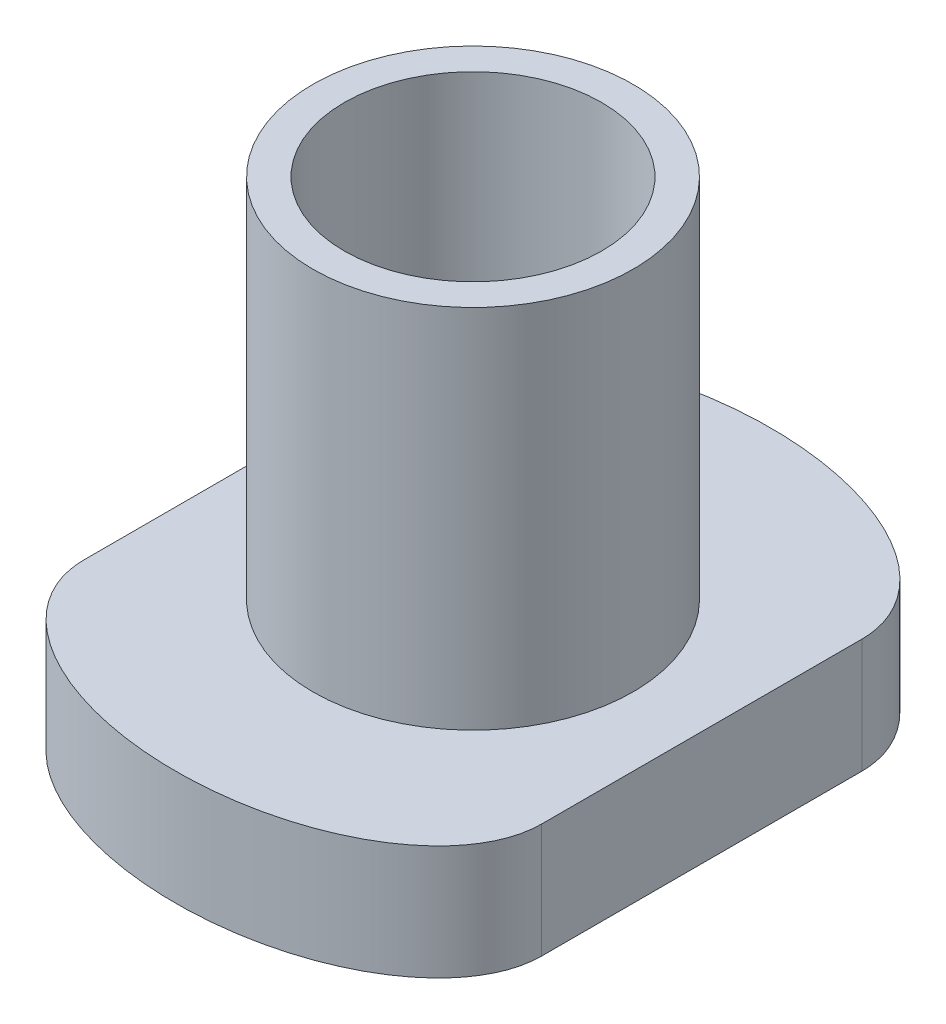
ISO-10303-21;
HEADER;
FILE_DESCRIPTION(('STEP AP214'),'2;1');
FILE_NAME('part.step','',(''),(''),'','','');
FILE_SCHEMA(('AUTOMOTIVE_DESIGN { 1 0 10303 214 1 1 1 1 }'));
ENDSEC;
DATA;
#1=APPLICATION_CONTEXT('core data for automotive mechanical design processes');
#2=APPLICATION_PROTOCOL_DEFINITION('international standard','automotive_design',2000,#1);
#3=PRODUCT_CONTEXT('',#1,'mechanical');
#4=PRODUCT('Part','Part','',(#3));
#5=PRODUCT_RELATED_PRODUCT_CATEGORY('part','',(#4));
#6=PRODUCT_DEFINITION_FORMATION('','',#4);
#7=PRODUCT_DEFINITION_CONTEXT('part definition',#1,'design');
#8=PRODUCT_DEFINITION('design','',#6,#7);
#9=PRODUCT_DEFINITION_SHAPE('','',#8);
#10=(LENGTH_UNIT() NAMED_UNIT(*) SI_UNIT(.MILLI.,.METRE.));
#11=(NAMED_UNIT(*) PLANE_ANGLE_UNIT() SI_UNIT($,.RADIAN.));
#12=(NAMED_UNIT(*) SI_UNIT($,.STERADIAN.) SOLID_ANGLE_UNIT());
#13=UNCERTAINTY_MEASURE_WITH_UNIT(LENGTH_MEASURE(1.E-05),#10,'distance_accuracy_value','');
#14=(GEOMETRIC_REPRESENTATION_CONTEXT(3) GLOBAL_UNCERTAINTY_ASSIGNED_CONTEXT((#13)) GLOBAL_UNIT_ASSIGNED_CONTEXT((#10,
#11,#12)) REPRESENTATION_CONTEXT('',''));
#15=CARTESIAN_POINT('',(0.,0.,0.));
#16=DIRECTION('',(0.,0.,1.));
#17=DIRECTION('',(1.,0.,0.));
#18=AXIS2_PLACEMENT_3D('',#15,#16,#17);
#19=CARTESIAN_POINT('',(0.,10.,-40.));
#20=DIRECTION('',(1.,0.,0.));
#21=DIRECTION('',(0.,0.,-1.));
#22=AXIS2_PLACEMENT_3D('',#19,#20,#21);
#23=PLANE('',#22);
#24=DIRECTION('',(0.,0.,1.));
#25=VECTOR('',#24,1.);
#26=CARTESIAN_POINT('',(0.,0.,-40.));
#27=LINE('',#26,#25);
#28=CARTESIAN_POINT('',(0.,0.,-40.));
#29=VERTEX_POINT('',#28);
#30=CARTESIAN_POINT('',(0.,0.,-12.));
#31=VERTEX_POINT('',#30);
#32=EDGE_CURVE('E118',#29,#31,#27,.T.);
#33=ORIENTED_EDGE('',*,*,#32,.T.);
#34=DIRECTION('',(0.,-1.,0.));
#35=VECTOR('',#34,1.);
#36=CARTESIAN_POINT('',(0.,10.,-12.));
#37=LINE('',#36,#35);
#38=CARTESIAN_POINT('',(0.,10.,-12.));
#39=VERTEX_POINT('',#38);
#40=EDGE_CURVE('E48',#39,#31,#37,.T.);
#41=ORIENTED_EDGE('',*,*,#40,.F.);
#42=DIRECTION('',(0.,0.,1.));
#43=VECTOR('',#42,1.);
#44=CARTESIAN_POINT('',(0.,10.,-40.));
#45=LINE('',#44,#43);
#46=CARTESIAN_POINT('',(0.,10.,-40.));
#47=VERTEX_POINT('',#46);
#48=EDGE_CURVE('E88',#47,#39,#45,.T.);
#49=ORIENTED_EDGE('',*,*,#48,.F.);
#50=DIRECTION('',(0.,-1.,0.));
#51=VECTOR('',#50,1.);
#52=CARTESIAN_POINT('',(0.,10.,-40.));
#53=LINE('',#52,#51);
#54=EDGE_CURVE('E63',#47,#29,#53,.T.);
#55=ORIENTED_EDGE('',*,*,#54,.T.);
#56=EDGE_LOOP('',(#33,#41,#49,#55));
#57=FACE_BOUND('',#56,.T.);
#58=ADVANCED_FACE('F45',(#57),#23,.F.);
#59=CARTESIAN_POINT('',(20.,10.,-12.));
#60=DIRECTION('',(0.,-1.,0.));
#61=DIRECTION('',(1.,0.,0.));
#62=AXIS2_PLACEMENT_3D('',#59,#60,#61);
#63=ELLIPSE('',#62,20.,12.);
#64=DIRECTION('',(0.,-1.,0.));
#65=VECTOR('',#64,1.);
#66=SURFACE_OF_LINEAR_EXTRUSION('',#63,#65);
#67=CARTESIAN_POINT('',(20.,0.,-12.));
#68=DIRECTION('',(0.,-1.,0.));
#69=DIRECTION('',(1.,0.,0.));
#70=AXIS2_PLACEMENT_3D('',#67,#68,#69);
#71=ELLIPSE('',#70,20.,12.);
#72=CARTESIAN_POINT('',(40.,0.,-12.));
#73=VERTEX_POINT('',#72);
#74=EDGE_CURVE('E98',#73,#31,#71,.T.);
#75=ORIENTED_EDGE('',*,*,#74,.F.);
#76=DIRECTION('',(0.,-1.,0.));
#77=VECTOR('',#76,1.);
#78=CARTESIAN_POINT('',(40.,10.,-12.));
#79=LINE('',#78,#77);
#80=CARTESIAN_POINT('',(40.,10.,-12.));
#81=VERTEX_POINT('',#80);
#82=EDGE_CURVE('E94',#81,#73,#79,.T.);
#83=ORIENTED_EDGE('',*,*,#82,.F.);
#84=EDGE_CURVE('E96',#81,#39,#63,.T.);
#85=ORIENTED_EDGE('',*,*,#84,.T.);
#86=ORIENTED_EDGE('',*,*,#40,.T.);
#87=EDGE_LOOP('',(#75,#83,#85,#86));
#88=FACE_BOUND('',#87,.T.);
#89=ADVANCED_FACE('F95',(#88),#66,.T.);
#90=CARTESIAN_POINT('',(40.,10.,-40.));
#91=DIRECTION('',(1.,0.,0.));
#92=DIRECTION('',(0.,0.,-1.));
#93=AXIS2_PLACEMENT_3D('',#90,#91,#92);
#94=PLANE('',#93);
#95=DIRECTION('',(0.,0.,1.));
#96=VECTOR('',#95,1.);
#97=CARTESIAN_POINT('',(40.,0.,-40.));
#98=LINE('',#97,#96);
#99=CARTESIAN_POINT('',(40.,0.,-40.));
#100=VERTEX_POINT('',#99);
#101=EDGE_CURVE('E138',#100,#73,#98,.T.);
#102=ORIENTED_EDGE('',*,*,#101,.F.);
#103=DIRECTION('',(0.,-1.,0.));
#104=VECTOR('',#103,1.);
#105=CARTESIAN_POINT('',(40.,10.,-40.));
#106=LINE('',#105,#104);
#107=CARTESIAN_POINT('',(40.,10.,-40.));
#108=VERTEX_POINT('',#107);
#109=EDGE_CURVE('E77',#108,#100,#106,.T.);
#110=ORIENTED_EDGE('',*,*,#109,.F.);
#111=DIRECTION('',(0.,0.,1.));
#112=VECTOR('',#111,1.);
#113=CARTESIAN_POINT('',(40.,10.,-40.));
#114=LINE('',#113,#112);
#115=EDGE_CURVE('E105',#108,#81,#114,.T.);
#116=ORIENTED_EDGE('',*,*,#115,.T.);
#117=ORIENTED_EDGE('',*,*,#82,.T.);
#118=EDGE_LOOP('',(#102,#110,#116,#117));
#119=FACE_BOUND('',#118,.T.);
#120=ADVANCED_FACE('F108',(#119),#94,.T.);
#121=CARTESIAN_POINT('',(20.,10.,-40.));
#122=DIRECTION('',(0.,-1.,0.));
#123=DIRECTION('',(-1.,0.,0.));
#124=AXIS2_PLACEMENT_3D('',#121,#122,#123);
#125=ELLIPSE('',#124,20.,12.);
#126=DIRECTION('',(0.,-1.,0.));
#127=VECTOR('',#126,1.);
#128=SURFACE_OF_LINEAR_EXTRUSION('',#125,#127);
#129=CARTESIAN_POINT('',(20.,0.,-40.));
#130=DIRECTION('',(0.,-1.,0.));
#131=DIRECTION('',(-1.,0.,0.));
#132=AXIS2_PLACEMENT_3D('',#129,#130,#131);
#133=ELLIPSE('',#132,20.,12.);
#134=EDGE_CURVE('E141',#29,#100,#133,.T.);
#135=ORIENTED_EDGE('',*,*,#134,.F.);
#136=ORIENTED_EDGE('',*,*,#54,.F.);
#137=EDGE_CURVE('E110',#47,#108,#125,.T.);
#138=ORIENTED_EDGE('',*,*,#137,.T.);
#139=ORIENTED_EDGE('',*,*,#109,.T.);
#140=EDGE_LOOP('',(#135,#136,#138,#139));
#141=FACE_BOUND('',#140,.T.);
#142=ADVANCED_FACE('F121',(#141),#128,.T.);
#143=CARTESIAN_POINT('',(20.,10.,-12.));
#144=DIRECTION('',(0.,-1.,0.));
#145=DIRECTION('',(0.,0.,-1.));
#146=AXIS2_PLACEMENT_3D('',#143,#144,#145);
#147=PLANE('',#146);
#148=CARTESIAN_POINT('',(20.,10.,-26.));
#149=DIRECTION('',(0.,1.,0.));
#150=DIRECTION('',(0.,0.,1.));
#151=AXIS2_PLACEMENT_3D('',#148,#149,#150);
#152=CIRCLE('',#151,14.);
#153=CARTESIAN_POINT('',(20.,10.,-12.));
#154=VERTEX_POINT('',#153);
#155=EDGE_CURVE('E11',#154,#154,#152,.T.);
#156=ORIENTED_EDGE('',*,*,#155,.F.);
#157=EDGE_LOOP('',(#156));
#158=FACE_BOUND('',#157,.T.);
#159=ORIENTED_EDGE('',*,*,#48,.T.);
#160=ORIENTED_EDGE('',*,*,#84,.F.);
#161=ORIENTED_EDGE('',*,*,#115,.F.);
#162=ORIENTED_EDGE('',*,*,#137,.F.);
#163=EDGE_LOOP('',(#159,#160,#161,#162));
#164=FACE_BOUND('',#163,.T.);
#165=ADVANCED_FACE('F104',(#158,#164),#147,.F.);
#166=CARTESIAN_POINT('',(20.,0.,-12.));
#167=DIRECTION('',(0.,-1.,0.));
#168=DIRECTION('',(0.,0.,-1.));
#169=AXIS2_PLACEMENT_3D('',#166,#167,#168);
#170=PLANE('',#169);
#171=CARTESIAN_POINT('',(20.,0.,-26.));
#172=DIRECTION('',(0.,1.,0.));
#173=DIRECTION('',(0.,0.,1.));
#174=AXIS2_PLACEMENT_3D('',#171,#172,#173);
#175=CIRCLE('',#174,11.25);
#176=CARTESIAN_POINT('',(20.,0.,-14.75));
#177=VERTEX_POINT('',#176);
#178=EDGE_CURVE('E155',#177,#177,#175,.T.);
#179=ORIENTED_EDGE('',*,*,#178,.T.);
#180=EDGE_LOOP('',(#179));
#181=FACE_BOUND('',#180,.T.);
#182=ORIENTED_EDGE('',*,*,#32,.F.);
#183=ORIENTED_EDGE('',*,*,#134,.T.);
#184=ORIENTED_EDGE('',*,*,#101,.T.);
#185=ORIENTED_EDGE('',*,*,#74,.T.);
#186=EDGE_LOOP('',(#182,#183,#184,#185));
#187=FACE_BOUND('',#186,.T.);
#188=ADVANCED_FACE('F125',(#181,#187),#170,.T.);
#189=CARTESIAN_POINT('',(20.,42.,-26.));
#190=DIRECTION('',(0.,-1.,0.));
#191=DIRECTION('',(0.,0.,-1.));
#192=AXIS2_PLACEMENT_3D('',#189,#190,#191);
#193=CYLINDRICAL_SURFACE('',#192,14.);
#194=CARTESIAN_POINT('',(20.,42.,-26.));
#195=DIRECTION('',(0.,1.,0.));
#196=DIRECTION('',(0.,0.,1.));
#197=AXIS2_PLACEMENT_3D('',#194,#195,#196);
#198=CIRCLE('',#197,14.);
#199=CARTESIAN_POINT('',(20.,42.,-12.));
#200=VERTEX_POINT('',#199);
#201=EDGE_CURVE('E137',#200,#200,#198,.T.);
#202=ORIENTED_EDGE('',*,*,#201,.F.);
#203=EDGE_LOOP('',(#202));
#204=FACE_BOUND('',#203,.T.);
#205=ORIENTED_EDGE('',*,*,#155,.T.);
#206=EDGE_LOOP('',(#205));
#207=FACE_BOUND('',#206,.T.);
#208=ADVANCED_FACE('F174',(#204,#207),#193,.T.);
#209=CARTESIAN_POINT('',(20.,42.,-26.));
#210=DIRECTION('',(0.,1.,0.));
#211=DIRECTION('',(0.,0.,1.));
#212=AXIS2_PLACEMENT_3D('',#209,#210,#211);
#213=PLANE('',#212);
#214=CARTESIAN_POINT('',(20.,42.,-26.));
#215=DIRECTION('',(0.,1.,0.));
#216=DIRECTION('',(0.,0.,1.));
#217=AXIS2_PLACEMENT_3D('',#214,#215,#216);
#218=CIRCLE('',#217,11.25);
#219=CARTESIAN_POINT('',(20.,42.,-14.75));
#220=VERTEX_POINT('',#219);
#221=EDGE_CURVE('E156',#220,#220,#218,.T.);
#222=ORIENTED_EDGE('',*,*,#221,.F.);
#223=EDGE_LOOP('',(#222));
#224=FACE_BOUND('',#223,.T.);
#225=ORIENTED_EDGE('',*,*,#201,.T.);
#226=EDGE_LOOP('',(#225));
#227=FACE_BOUND('',#226,.T.);
#228=ADVANCED_FACE('F168',(#224,#227),#213,.T.);
#229=CARTESIAN_POINT('',(20.,0.,-26.));
#230=DIRECTION('',(0.,1.,0.));
#231=DIRECTION('',(0.,0.,1.));
#232=AXIS2_PLACEMENT_3D('',#229,#230,#231);
#233=CYLINDRICAL_SURFACE('',#232,11.25);
#234=CARTESIAN_POINT('',(20.,0.,-14.75));
#235=CARTESIAN_POINT('',(20.,0.437499999999999,-14.75));
#236=CARTESIAN_POINT('',(20.,0.875,-14.75));
#237=CARTESIAN_POINT('',(20.,1.75,-14.75));
#238=CARTESIAN_POINT('',(20.,2.1875,-14.75));
#239=CARTESIAN_POINT('',(20.,3.0625,-14.75));
#240=CARTESIAN_POINT('',(20.,3.5,-14.75));
#241=CARTESIAN_POINT('',(20.,4.375,-14.75));
#242=CARTESIAN_POINT('',(20.,4.8125,-14.75));
#243=CARTESIAN_POINT('',(20.,5.6875,-14.75));
#244=CARTESIAN_POINT('',(20.,6.125,-14.75));
#245=CARTESIAN_POINT('',(20.,7.,-14.75));
#246=CARTESIAN_POINT('',(20.,7.4375,-14.75));
#247=CARTESIAN_POINT('',(20.,8.3125,-14.75));
#248=CARTESIAN_POINT('',(20.,8.75,-14.75));
#249=CARTESIAN_POINT('',(20.,9.625,-14.75));
#250=CARTESIAN_POINT('',(20.,10.0625,-14.75));
#251=CARTESIAN_POINT('',(20.,10.9375,-14.75));
#252=CARTESIAN_POINT('',(20.,11.375,-14.75));
#253=CARTESIAN_POINT('',(20.,12.25,-14.75));
#254=CARTESIAN_POINT('',(20.,12.6875,-14.75));
#255=CARTESIAN_POINT('',(20.,13.5625,-14.75));
#256=CARTESIAN_POINT('',(20.,14.,-14.75));
#257=CARTESIAN_POINT('',(20.,14.875,-14.75));
#258=CARTESIAN_POINT('',(20.,15.3125,-14.75));
#259=CARTESIAN_POINT('',(20.,16.1875,-14.75));
#260=CARTESIAN_POINT('',(20.,16.625,-14.75));
#261=CARTESIAN_POINT('',(20.,17.5,-14.75));
#262=CARTESIAN_POINT('',(20.,17.9375,-14.75));
#263=CARTESIAN_POINT('',(20.,18.8125,-14.75));
#264=CARTESIAN_POINT('',(20.,19.25,-14.75));
#265=CARTESIAN_POINT('',(20.,20.125,-14.75));
#266=CARTESIAN_POINT('',(20.,20.5625,-14.75));
#267=CARTESIAN_POINT('',(20.,21.4375,-14.75));
#268=CARTESIAN_POINT('',(20.,21.875,-14.75));
#269=CARTESIAN_POINT('',(20.,22.75,-14.75));
#270=CARTESIAN_POINT('',(20.,23.1875,-14.75));
#271=CARTESIAN_POINT('',(20.,24.0625,-14.75));
#272=CARTESIAN_POINT('',(20.,24.5,-14.75));
#273=CARTESIAN_POINT('',(20.,25.375,-14.75));
#274=CARTESIAN_POINT('',(20.,25.8125,-14.75));
#275=CARTESIAN_POINT('',(20.,26.6875,-14.75));
#276=CARTESIAN_POINT('',(20.,27.125,-14.75));
#277=CARTESIAN_POINT('',(20.,28.,-14.75));
#278=CARTESIAN_POINT('',(20.,28.4375,-14.75));
#279=CARTESIAN_POINT('',(20.,29.3125,-14.75));
#280=CARTESIAN_POINT('',(20.,29.75,-14.75));
#281=CARTESIAN_POINT('',(20.,30.625,-14.75));
#282=CARTESIAN_POINT('',(20.,31.0625,-14.75));
#283=CARTESIAN_POINT('',(20.,31.9375,-14.75));
#284=CARTESIAN_POINT('',(20.,32.375,-14.75));
#285=CARTESIAN_POINT('',(20.,33.25,-14.75));
#286=CARTESIAN_POINT('',(20.,33.6875,-14.75));
#287=CARTESIAN_POINT('',(20.,34.5625,-14.75));
#288=CARTESIAN_POINT('',(20.,35.,-14.75));
#289=CARTESIAN_POINT('',(20.,35.875,-14.75));
#290=CARTESIAN_POINT('',(20.,36.3125,-14.75));
#291=CARTESIAN_POINT('',(20.,37.1875,-14.75));
#292=CARTESIAN_POINT('',(20.,37.625,-14.75));
#293=CARTESIAN_POINT('',(20.,38.5,-14.75));
#294=CARTESIAN_POINT('',(20.,38.9375,-14.75));
#295=CARTESIAN_POINT('',(20.,39.8125,-14.75));
#296=CARTESIAN_POINT('',(20.,40.25,-14.75));
#297=CARTESIAN_POINT('',(20.,41.125,-14.75));
#298=CARTESIAN_POINT('',(20.,41.5625,-14.75));
#299=CARTESIAN_POINT('',(20.,42.,-14.75));
#300=B_SPLINE_CURVE_WITH_KNOTS('',3,(#234,#235,#236,#237,#238,#239,#240,#241,#242,#243,#244,
#245,#246,#247,#248,#249,#250,#251,#252,#253,#254,#255,#256,#257,#258,#259,#260,#261,#262,#263,
#264,#265,#266,#267,#268,#269,#270,#271,#272,#273,#274,#275,#276,#277,#278,#279,#280,#281,#282,
#283,#284,#285,#286,#287,#288,#289,#290,#291,#292,#293,#294,#295,#296,#297,#298,#299),
.UNSPECIFIED.,.F.,.F.,(4,2,2,2,2,2,2,2,2,2,2,2,2,2,2,2,2,2,2,2,2,2,2,2,2,2,2,2,2,2,2,2,4),(0.,
1.3125,2.625,3.9375,5.25,6.5625,7.875,9.1875,10.5,11.8125,13.125,14.4375,15.75,17.0625,18.375,
19.6875,21.,22.3125,23.625,24.9375,26.25,27.5625,28.875,30.1875,31.5,32.8125,34.125,35.4375,
36.75,38.0625,39.375,40.6875,42.),.UNSPECIFIED.);
#301=EDGE_CURVE('BSEAM165',#177,#220,#300,.T.);
#302=ORIENTED_EDGE('',*,*,#178,.F.);
#303=ORIENTED_EDGE('',*,*,#221,.T.);
#304=ORIENTED_EDGE('',*,*,#301,.T.);
#305=ORIENTED_EDGE('',*,*,#301,.F.);
#306=EDGE_LOOP('',(#302,#304,#303,#305));
#307=FACE_BOUND('',#306,.T.);
#308=ADVANCED_FACE('F165',(#307),#233,.F.);
#309=CLOSED_SHELL('',(#58,#89,#120,#142,#165,#188,#208,#228,#308));
#310=MANIFOLD_SOLID_BREP('B2',#309);
#311=ADVANCED_BREP_SHAPE_REPRESENTATION('',(#18,#310),#14);
#312=SHAPE_DEFINITION_REPRESENTATION(#9,#311);
ENDSEC;
END-ISO-10303-21;
